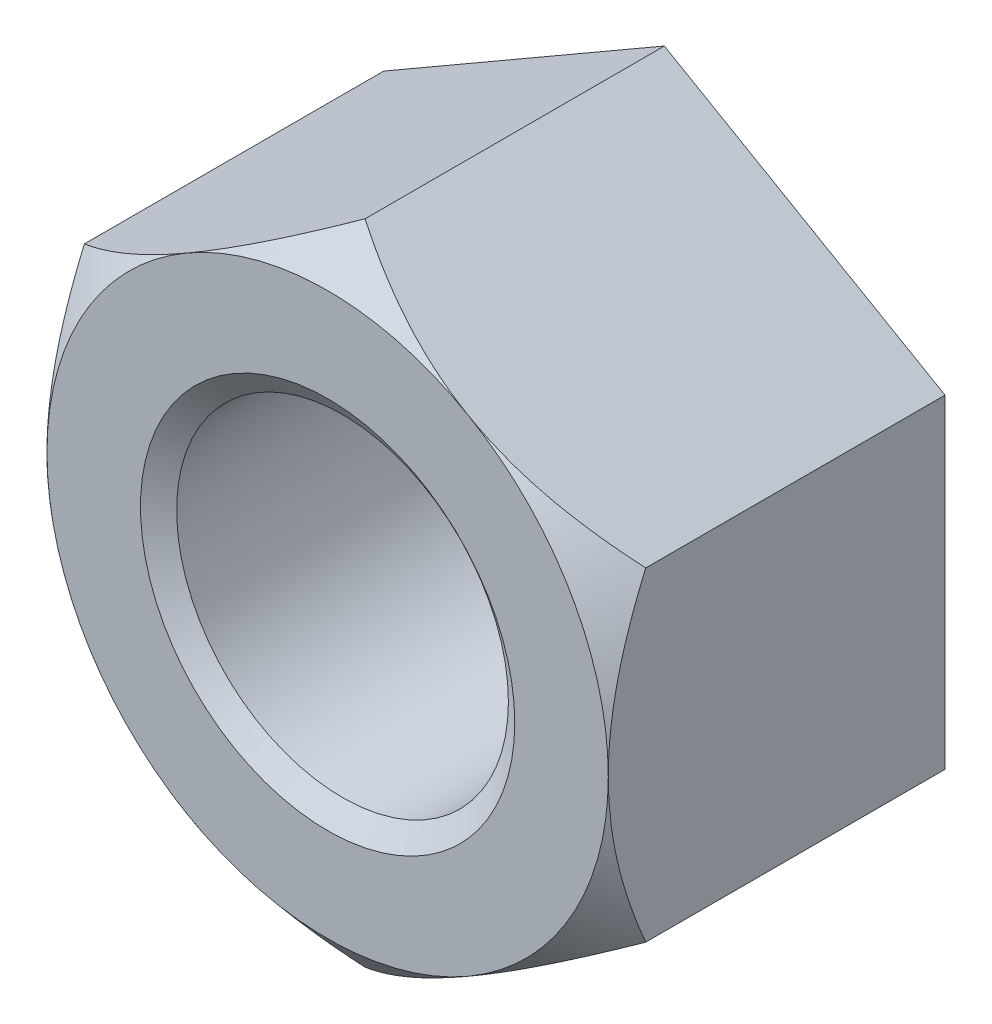
ISO-10303-21;
HEADER;
FILE_DESCRIPTION(('STEP AP214'),'2;1');
FILE_NAME('part.step','',(''),(''),'','','');
FILE_SCHEMA(('AUTOMOTIVE_DESIGN { 1 0 10303 214 1 1 1 1 }'));
ENDSEC;
DATA;
#1=APPLICATION_CONTEXT('core data for automotive mechanical design processes');
#2=APPLICATION_PROTOCOL_DEFINITION('international standard','automotive_design',2000,#1);
#3=PRODUCT_CONTEXT('',#1,'mechanical');
#4=PRODUCT('Part','Part','',(#3));
#5=PRODUCT_RELATED_PRODUCT_CATEGORY('part','',(#4));
#6=PRODUCT_DEFINITION_FORMATION('','',#4);
#7=PRODUCT_DEFINITION_CONTEXT('part definition',#1,'design');
#8=PRODUCT_DEFINITION('design','',#6,#7);
#9=PRODUCT_DEFINITION_SHAPE('','',#8);
#10=(LENGTH_UNIT() NAMED_UNIT(*) SI_UNIT(.MILLI.,.METRE.));
#11=(NAMED_UNIT(*) PLANE_ANGLE_UNIT() SI_UNIT($,.RADIAN.));
#12=(NAMED_UNIT(*) SI_UNIT($,.STERADIAN.) SOLID_ANGLE_UNIT());
#13=UNCERTAINTY_MEASURE_WITH_UNIT(LENGTH_MEASURE(1.E-05),#10,'distance_accuracy_value','');
#14=(GEOMETRIC_REPRESENTATION_CONTEXT(3) GLOBAL_UNCERTAINTY_ASSIGNED_CONTEXT((#13)) GLOBAL_UNIT_ASSIGNED_CONTEXT((#10,
#11,#12)) REPRESENTATION_CONTEXT('',''));
#15=CARTESIAN_POINT('',(0.,0.,0.));
#16=DIRECTION('',(0.,0.,1.));
#17=DIRECTION('',(1.,0.,0.));
#18=AXIS2_PLACEMENT_3D('',#15,#16,#17);
#19=CARTESIAN_POINT('',(0.,0.,-31.4198));
#20=DIRECTION('',(0.,0.,1.));
#21=DIRECTION('',(1.,0.,0.));
#22=AXIS2_PLACEMENT_3D('',#19,#20,#21);
#23=CYLINDRICAL_SURFACE('',#22,15.47876);
#24=CARTESIAN_POINT('',(0.,0.,-1.38902970184812));
#25=DIRECTION('',(0.,0.,1.));
#26=DIRECTION('',(1.,0.,0.));
#27=AXIS2_PLACEMENT_3D('',#24,#25,#26);
#28=CIRCLE('',#27,15.47876);
#29=CARTESIAN_POINT('',(15.47876,0.,-1.38902970184812));
#30=VERTEX_POINT('',#29);
#31=EDGE_CURVE('E130',#30,#30,#28,.F.);
#32=ORIENTED_EDGE('',*,*,#31,.F.);
#33=EDGE_LOOP('',(#32));
#34=FACE_BOUND('',#33,.T.);
#35=CARTESIAN_POINT('',(0.,0.,-30.0053702981519));
#36=DIRECTION('',(0.,0.,-1.));
#37=DIRECTION('',(-1.,0.,0.));
#38=AXIS2_PLACEMENT_3D('',#35,#36,#37);
#39=CIRCLE('',#38,15.47876);
#40=CARTESIAN_POINT('',(-15.47876,0.,-30.0053702981519));
#41=VERTEX_POINT('',#40);
#42=EDGE_CURVE('E37',#41,#41,#39,.F.);
#43=ORIENTED_EDGE('',*,*,#42,.F.);
#44=EDGE_LOOP('',(#43));
#45=FACE_BOUND('',#44,.T.);
#46=ADVANCED_FACE('F32',(#34,#45),#23,.F.);
#47=CARTESIAN_POINT('',(-52.3747999999999,0.,0.));
#48=DIRECTION('',(0.,0.,1.));
#49=DIRECTION('',(1.,0.,0.));
#50=AXIS2_PLACEMENT_3D('',#47,#48,#49);
#51=PLANE('',#50);
#52=CARTESIAN_POINT('',(0.,0.,0.));
#53=DIRECTION('',(0.,0.,1.));
#54=DIRECTION('',(1.,0.,0.));
#55=AXIS2_PLACEMENT_3D('',#52,#53,#54);
#56=CIRCLE('',#55,17.4625);
#57=CARTESIAN_POINT('',(17.4625,0.,0.));
#58=VERTEX_POINT('',#57);
#59=EDGE_CURVE('E217',#58,#58,#56,.T.);
#60=ORIENTED_EDGE('',*,*,#59,.F.);
#61=EDGE_LOOP('',(#60));
#62=FACE_BOUND('',#61,.T.);
#63=CARTESIAN_POINT('',(0.,0.,0.));
#64=DIRECTION('',(0.,0.,1.));
#65=DIRECTION('',(1.,0.,0.));
#66=AXIS2_PLACEMENT_3D('',#63,#64,#65);
#67=CIRCLE('',#66,26.1874);
#68=CARTESIAN_POINT('',(26.1874,0.,0.));
#69=VERTEX_POINT('',#68);
#70=CARTESIAN_POINT('',(13.0937,-22.6789536590646,0.));
#71=VERTEX_POINT('',#70);
#72=EDGE_CURVE('E11',#69,#71,#67,.F.);
#73=ORIENTED_EDGE('',*,*,#72,.F.);
#74=CARTESIAN_POINT('',(0.,0.,0.));
#75=DIRECTION('',(0.,0.,1.));
#76=DIRECTION('',(1.,0.,0.));
#77=AXIS2_PLACEMENT_3D('',#74,#75,#76);
#78=CIRCLE('',#77,26.1874);
#79=CARTESIAN_POINT('',(13.0937,22.6789536590646,0.));
#80=VERTEX_POINT('',#79);
#81=EDGE_CURVE('E122',#69,#80,#78,.T.);
#82=ORIENTED_EDGE('',*,*,#81,.T.);
#83=CARTESIAN_POINT('',(-13.0937,22.6789536590646,0.));
#84=VERTEX_POINT('',#83);
#85=EDGE_CURVE('E44',#84,#80,#67,.F.);
#86=ORIENTED_EDGE('',*,*,#85,.F.);
#87=CARTESIAN_POINT('',(-26.1874,0.,0.));
#88=VERTEX_POINT('',#87);
#89=EDGE_CURVE('E271',#88,#84,#67,.F.);
#90=ORIENTED_EDGE('',*,*,#89,.F.);
#91=CARTESIAN_POINT('',(-13.0937,-22.6789536590646,0.));
#92=VERTEX_POINT('',#91);
#93=EDGE_CURVE('E273',#92,#88,#67,.F.);
#94=ORIENTED_EDGE('',*,*,#93,.F.);
#95=EDGE_CURVE('E42',#71,#92,#67,.F.);
#96=ORIENTED_EDGE('',*,*,#95,.F.);
#97=EDGE_LOOP('',(#73,#82,#86,#90,#94,#96));
#98=FACE_BOUND('',#97,.T.);
#99=ADVANCED_FACE('F132',(#62,#98),#51,.T.);
#100=CARTESIAN_POINT('',(0.,30.2386048787528,-31.4198));
#101=DIRECTION('',(-0.500000000000001,0.866025403784438,0.));
#102=DIRECTION('',(-0.866025403784438,-0.500000000000001,0.));
#103=AXIS2_PLACEMENT_3D('',#100,#101,#102);
#104=PLANE('',#103);
#105=CARTESIAN_POINT('',(0.000199999999996811,30.2387203488067,-3.4925995460573));
#106=CARTESIAN_POINT('',(-0.513173394198176,29.9423240814716,-3.23712054460036));
#107=CARTESIAN_POINT('',(-1.030160973984,29.6438411631145,-2.99102600486844));
#108=CARTESIAN_POINT('',(-2.07185619918651,29.0424181444303,-2.52064199840242));
#109=CARTESIAN_POINT('',(-2.59656819967267,28.7394755297026,-2.2963654207915));
#110=CARTESIAN_POINT('',(-3.65628439390453,28.1276480996982,-1.87188633069804));
#111=CARTESIAN_POINT('',(-4.19132731275463,27.8187409264721,-1.67181180502062));
#112=CARTESIAN_POINT('',(-5.26885590207632,27.1966295053677,-1.3006798900169));
#113=CARTESIAN_POINT('',(-5.81134031031239,26.8834259862414,-1.12961764379398));
#114=CARTESIAN_POINT('',(-6.89352018851056,26.2586291422521,-0.822885333832221));
#115=CARTESIAN_POINT('',(-7.43309184425616,25.9471073015603,-0.686636703030734));
#116=CARTESIAN_POINT('',(-8.51801013727193,25.3207294330389,-0.448890131279074));
#117=CARTESIAN_POINT('',(-9.06335694603955,25.0058733061952,-0.347393225307198));
#118=CARTESIAN_POINT('',(-10.1571309574724,24.3743825862619,-0.182123961213425));
#119=CARTESIAN_POINT('',(-10.7055487163383,24.0577534455522,-0.118268913666265));
#120=CARTESIAN_POINT('',(-11.8047484870155,23.4231301620586,-0.0298594775374858));
#121=CARTESIAN_POINT('',(-12.3555303257296,23.1051361192122,-0.00530225918924691));
#122=CARTESIAN_POINT('',(-13.3804093314794,22.5134219493558,0.0031300715992425));
#123=CARTESIAN_POINT('',(-13.8544797111046,22.2397172880643,-0.00779494002805709));
#124=CARTESIAN_POINT('',(-14.8014126189524,21.6930053188139,-0.0590211283589545));
#125=CARTESIAN_POINT('',(-15.2742751872026,21.419997987745,-0.0993213185349796));
#126=CARTESIAN_POINT('',(-16.2178635349034,20.8752170011957,-0.20842230001161));
#127=CARTESIAN_POINT('',(-16.6885874735473,20.6034444085057,-0.277244166141045));
#128=CARTESIAN_POINT('',(-17.6264602653079,20.061963299717,-0.441912305855732));
#129=CARTESIAN_POINT('',(-18.0936090668783,19.7922548133788,-0.537758968334367));
#130=CARTESIAN_POINT('',(-19.0235590530769,19.2553479385141,-0.754617753182758));
#131=CARTESIAN_POINT('',(-19.4863595787717,18.9881499304231,-0.875633627377015));
#132=CARTESIAN_POINT('',(-20.4070035421374,18.4566158903461,-1.14072210773377));
#133=CARTESIAN_POINT('',(-20.8648462286806,18.1922802920239,-1.28479815681461));
#134=CARTESIAN_POINT('',(-22.2299280534777,17.4041499330114,-1.74815961312341));
#135=CARTESIAN_POINT('',(-23.1293122415491,16.8848902299235,-2.09872149466566));
#136=CARTESIAN_POINT('',(-24.3833445228425,16.1608743547463,-2.64044063744209));
#137=CARTESIAN_POINT('',(-24.7472444629569,15.9507766263632,-2.80407568480622));
#138=CARTESIAN_POINT('',(-25.4705171607616,15.5331949395881,-3.14115557011202));
#139=CARTESIAN_POINT('',(-25.8298992747983,15.3257055793071,-3.31457361129248));
#140=CARTESIAN_POINT('',(-26.1876,15.1191869693225,-3.49259954605727));
#141=B_SPLINE_CURVE_WITH_KNOTS('',3,(#105,#106,#107,#108,#109,#110,#111,#112,#113,#114,#115,
#116,#117,#118,#119,#120,#121,#122,#123,#124,#125,#126,#127,#128,#129,#130,#131,#132,#133,#134,
#135,#136,#137,#138,#139,#140),.UNSPECIFIED.,.F.,.F.,(4,2,2,2,2,2,2,2,2,2,2,2,2,2,2,2,2,4),(0.,
1.9366001538316,3.87433750819639,5.82191141966341,7.76915896856066,9.68156029667425,
11.5940185751047,13.5022598687817,15.410363747221,17.0521398184253,18.6938607552331,
20.3367969379905,21.9797567642053,23.6229616724106,25.26641214279,28.5512264803038,
29.9039535576959,31.2531400595894),.UNSPECIFIED.);
#142=CARTESIAN_POINT('',(0.,30.2386048787528,-3.4925));
#143=VERTEX_POINT('',#142);
#144=EDGE_CURVE('E182',#143,#84,#141,.T.);
#145=ORIENTED_EDGE('',*,*,#144,.F.);
#146=DIRECTION('',(0.,0.,1.));
#147=VECTOR('',#146,1.);
#148=CARTESIAN_POINT('',(0.,30.2386048787528,-31.4198));
#149=LINE('',#148,#147);
#150=CARTESIAN_POINT('',(0.,30.2386048787528,-31.4198));
#151=VERTEX_POINT('',#150);
#152=EDGE_CURVE('E241',#151,#143,#149,.T.);
#153=ORIENTED_EDGE('',*,*,#152,.F.);
#154=DIRECTION('',(-0.866025403784438,-0.500000000000001,0.));
#155=VECTOR('',#154,1.);
#156=CARTESIAN_POINT('',(0.,30.2386048787528,-31.4198));
#157=LINE('',#156,#155);
#158=CARTESIAN_POINT('',(-26.1874,15.1193024393764,-31.4198));
#159=VERTEX_POINT('',#158);
#160=EDGE_CURVE('E138',#151,#159,#157,.T.);
#161=ORIENTED_EDGE('',*,*,#160,.T.);
#162=DIRECTION('',(0.,0.,1.));
#163=VECTOR('',#162,1.);
#164=CARTESIAN_POINT('',(-26.1874,15.1193024393764,-31.4198));
#165=LINE('',#164,#163);
#166=CARTESIAN_POINT('',(-26.1874,15.1193024393764,-3.4925));
#167=VERTEX_POINT('',#166);
#168=EDGE_CURVE('E228',#159,#167,#165,.T.);
#169=ORIENTED_EDGE('',*,*,#168,.T.);
#170=EDGE_CURVE('E177',#84,#167,#141,.T.);
#171=ORIENTED_EDGE('',*,*,#170,.F.);
#172=EDGE_LOOP('',(#145,#153,#161,#169,#171));
#173=FACE_BOUND('',#172,.T.);
#174=ADVANCED_FACE('F34',(#173),#104,.T.);
#175=CARTESIAN_POINT('',(26.1874,15.1193024393764,-31.4198));
#176=DIRECTION('',(0.500000000000001,0.866025403784438,0.));
#177=DIRECTION('',(-0.866025403784438,0.500000000000001,0.));
#178=AXIS2_PLACEMENT_3D('',#175,#176,#177);
#179=PLANE('',#178);
#180=CARTESIAN_POINT('',(26.1876,15.1191869693225,-3.49259954605727));
#181=CARTESIAN_POINT('',(25.6742266058018,15.4155832366577,-3.23712054460033));
#182=CARTESIAN_POINT('',(25.157239026016,15.7140661550147,-2.99102600486842));
#183=CARTESIAN_POINT('',(24.1155438008135,16.3154891736989,-2.5206419984024));
#184=CARTESIAN_POINT('',(23.5908318003273,16.6184317884266,-2.29636542079148));
#185=CARTESIAN_POINT('',(22.5311156060955,17.230259218431,-1.87188633069802));
#186=CARTESIAN_POINT('',(21.9960726872454,17.5391663916571,-1.6718118050206));
#187=CARTESIAN_POINT('',(20.9185440979237,18.1612778127615,-1.30067989001689));
#188=CARTESIAN_POINT('',(20.3760596896876,18.4744813318878,-1.12961764379397));
#189=CARTESIAN_POINT('',(19.2938798114894,19.0992781758771,-0.822885333832213));
#190=CARTESIAN_POINT('',(18.7543081557438,19.4108000165689,-0.686636703030725));
#191=CARTESIAN_POINT('',(17.6693898627281,20.0371778850903,-0.448890131279066));
#192=CARTESIAN_POINT('',(17.1240430539605,20.352034011934,-0.347393225307192));
#193=CARTESIAN_POINT('',(16.0302690425277,20.9835247318673,-0.182123961213423));
#194=CARTESIAN_POINT('',(15.4818512836617,21.300153872577,-0.118268913666263));
#195=CARTESIAN_POINT('',(14.3826515129845,21.9347771560706,-0.0298594775374856));
#196=CARTESIAN_POINT('',(13.8318696742704,22.2527711989169,-0.00530225918924716));
#197=CARTESIAN_POINT('',(12.8069906685206,22.8444853687734,0.00313007159924154));
#198=CARTESIAN_POINT('',(12.3329202888954,23.1181900300648,-0.00779494002805839));
#199=CARTESIAN_POINT('',(11.3859873810476,23.6649019993153,-0.0590211283589573));
#200=CARTESIAN_POINT('',(10.9131248127974,23.9379093303842,-0.0993213185349835));
#201=CARTESIAN_POINT('',(9.96953646509659,24.4826903169335,-0.208422300011616));
#202=CARTESIAN_POINT('',(9.49881252645276,24.7544629096235,-0.277244166141053));
#203=CARTESIAN_POINT('',(8.56093973469211,25.2959440184122,-0.441912305855739));
#204=CARTESIAN_POINT('',(8.09379093312174,25.5656525047504,-0.537758968334371));
#205=CARTESIAN_POINT('',(7.16384094692312,26.1025593796151,-0.754617753182763));
#206=CARTESIAN_POINT('',(6.7010404212283,26.3697573877061,-0.875633627377023));
#207=CARTESIAN_POINT('',(5.78039645786259,26.9012914277831,-1.14072210773378));
#208=CARTESIAN_POINT('',(5.32255377131939,27.1656270261053,-1.28479815681462));
#209=CARTESIAN_POINT('',(3.95747194652233,27.9537573851178,-1.74815961312341));
#210=CARTESIAN_POINT('',(3.05808775845095,28.4730170882057,-2.09872149466566));
#211=CARTESIAN_POINT('',(1.80405547715751,29.1970329633829,-2.6404406374421));
#212=CARTESIAN_POINT('',(1.44015553704315,29.407130691766,-2.80407568480623));
#213=CARTESIAN_POINT('',(0.716882839238417,29.8247123785411,-3.14115557011204));
#214=CARTESIAN_POINT('',(0.3575007252017,30.0322017388221,-3.3145736112925));
#215=CARTESIAN_POINT('',(-0.000200000000002632,30.2387203488067,-3.4925995460573));
#216=B_SPLINE_CURVE_WITH_KNOTS('',3,(#180,#181,#182,#183,#184,#185,#186,#187,#188,#189,#190,
#191,#192,#193,#194,#195,#196,#197,#198,#199,#200,#201,#202,#203,#204,#205,#206,#207,#208,#209,
#210,#211,#212,#213,#214,#215),.UNSPECIFIED.,.F.,.F.,(4,2,2,2,2,2,2,2,2,2,2,2,2,2,2,2,2,4),(0.,
1.9366001538316,3.87433750819638,5.82191141966339,7.76915896856064,9.68156029667423,
11.5940185751047,13.5022598687817,15.4103637472209,17.0521398184253,18.6938607552331,
20.3367969379905,21.9797567642053,23.6229616724105,25.26641214279,28.5512264803038,
29.9039535576959,31.2531400595894),.UNSPECIFIED.);
#217=CARTESIAN_POINT('',(26.1874,15.1193024393764,-3.4925));
#218=VERTEX_POINT('',#217);
#219=EDGE_CURVE('E125',#218,#80,#216,.T.);
#220=ORIENTED_EDGE('',*,*,#219,.F.);
#221=DIRECTION('',(0.,0.,1.));
#222=VECTOR('',#221,1.);
#223=CARTESIAN_POINT('',(26.1874,15.1193024393764,-31.4198));
#224=LINE('',#223,#222);
#225=CARTESIAN_POINT('',(26.1874,15.1193024393764,-31.4198));
#226=VERTEX_POINT('',#225);
#227=EDGE_CURVE('E137',#226,#218,#224,.T.);
#228=ORIENTED_EDGE('',*,*,#227,.F.);
#229=DIRECTION('',(-0.866025403784438,0.500000000000001,0.));
#230=VECTOR('',#229,1.);
#231=CARTESIAN_POINT('',(26.1874,15.1193024393764,-31.4198));
#232=LINE('',#231,#230);
#233=EDGE_CURVE('E232',#226,#151,#232,.T.);
#234=ORIENTED_EDGE('',*,*,#233,.T.);
#235=ORIENTED_EDGE('',*,*,#152,.T.);
#236=EDGE_CURVE('E148',#80,#143,#216,.T.);
#237=ORIENTED_EDGE('',*,*,#236,.F.);
#238=EDGE_LOOP('',(#220,#228,#234,#235,#237));
#239=FACE_BOUND('',#238,.T.);
#240=ADVANCED_FACE('F163',(#239),#179,.T.);
#241=CARTESIAN_POINT('',(26.1874,15.1193024393764,-31.4198));
#242=DIRECTION('',(-1.,0.,0.));
#243=DIRECTION('',(0.,0.,1.));
#244=AXIS2_PLACEMENT_3D('',#241,#242,#243);
#245=PLANE('',#244);
#246=ORIENTED_EDGE('',*,*,#227,.T.);
#247=CARTESIAN_POINT('',(26.1874,-33.4640354906226,-14.0565423629271));
#248=CARTESIAN_POINT('',(26.1874,-33.0407746347166,-13.7691881736319));
#249=CARTESIAN_POINT('',(26.1874,-32.6165571106371,-13.4832440937609));
#250=CARTESIAN_POINT('',(26.1874,-31.7660401415196,-12.914455485409));
#251=CARTESIAN_POINT('',(26.1874,-31.339740664267,-12.6316110051099));
#252=CARTESIAN_POINT('',(26.1874,-30.0573097291377,-11.788043237694));
#253=CARTESIAN_POINT('',(26.1874,-29.1978203606967,-11.2324044816204));
#254=CARTESIAN_POINT('',(26.1874,-27.4622936158139,-10.1336577392283));
#255=CARTESIAN_POINT('',(26.1874,-26.5861821055641,-9.59066658940168));
#256=CARTESIAN_POINT('',(26.1874,-24.8216648023432,-8.52510234082127));
#257=CARTESIAN_POINT('',(26.1874,-23.9332597888499,-8.00252795548914));
#258=CARTESIAN_POINT('',(26.1874,-22.0934376846439,-6.95488948540693));
#259=CARTESIAN_POINT('',(26.1874,-21.1412173228405,-6.43122911959484));
#260=CARTESIAN_POINT('',(26.1874,-19.2179109755683,-5.41917114747219));
#261=CARTESIAN_POINT('',(26.1874,-18.2468222505134,-4.93077871117163));
#262=CARTESIAN_POINT('',(26.1874,-16.2858249096375,-4.00024738579759));
#263=CARTESIAN_POINT('',(26.1874,-15.2959747009191,-3.5579862416223));
#264=CARTESIAN_POINT('',(26.1874,-13.2927456398708,-2.73059024447434));
#265=CARTESIAN_POINT('',(26.1874,-12.2793767023743,-2.34543180695207));
#266=CARTESIAN_POINT('',(26.1874,-10.7553803630876,-1.82671246462318));
#267=CARTESIAN_POINT('',(26.1874,-10.2540776706142,-1.6655893102275));
#268=CARTESIAN_POINT('',(26.1874,-9.24575138068171,-1.36228852206027));
#269=CARTESIAN_POINT('',(26.1874,-8.73872795431945,-1.22011032329955));
#270=CARTESIAN_POINT('',(26.1874,-7.71922567786316,-0.95663251864597));
#271=CARTESIAN_POINT('',(26.1874,-7.20674644106776,-0.835334403312232));
#272=CARTESIAN_POINT('',(26.1874,-6.1769285738306,-0.615535347072359));
#273=CARTESIAN_POINT('',(26.1874,-5.65959024670224,-0.517032992925221));
#274=CARTESIAN_POINT('',(26.1874,-4.63047547477933,-0.346152584745227));
#275=CARTESIAN_POINT('',(26.1874,-4.11877434620285,-0.273323043401525));
#276=CARTESIAN_POINT('',(26.1874,-3.09242158702781,-0.15263877708194));
#277=CARTESIAN_POINT('',(26.1874,-2.57776997992021,-0.104783853543056));
#278=CARTESIAN_POINT('',(26.1874,-1.54674640128364,-0.0350055118174946));
#279=CARTESIAN_POINT('',(26.1874,-1.03037458020004,-0.0130798826865196));
#280=CARTESIAN_POINT('',(26.1874,0.00281373395253119,0.00439081573513733));
#281=CARTESIAN_POINT('',(26.1874,0.519630220482704,-6.37334660406017E-05));
#282=CARTESIAN_POINT('',(26.1874,1.51784720014737,-0.0340789658247308));
#283=CARTESIAN_POINT('',(26.1874,1.99930668816336,-0.0619421973765469));
#284=CARTESIAN_POINT('',(26.1874,2.96039298537845,-0.140052621075192));
#285=CARTESIAN_POINT('',(26.1874,3.44001982092807,-0.190299490151487));
#286=CARTESIAN_POINT('',(26.1874,4.39653344072961,-0.312320178016979));
#287=CARTESIAN_POINT('',(26.1874,4.87342010927479,-0.384094899134984));
#288=CARTESIAN_POINT('',(26.1874,5.82366675283079,-0.548023418550825));
#289=CARTESIAN_POINT('',(26.1874,6.29702668697732,-0.640177452605451));
#290=CARTESIAN_POINT('',(26.1874,7.24941488707848,-0.845630112305757));
#291=CARTESIAN_POINT('',(26.1874,7.72835665842312,-0.959328183429298));
#292=CARTESIAN_POINT('',(26.1874,8.68151250142992,-1.20500429553773));
#293=CARTESIAN_POINT('',(26.1874,9.15572653117801,-1.33698249843199));
#294=CARTESIAN_POINT('',(26.1874,10.0990528436431,-1.61759280287037));
#295=CARTESIAN_POINT('',(26.1874,10.5681664092471,-1.76622060511418));
#296=CARTESIAN_POINT('',(26.1874,11.501293499141,-2.07859293356846));
#297=CARTESIAN_POINT('',(26.1874,11.9653071604691,-2.24233705247585));
#298=CARTESIAN_POINT('',(26.1874,13.2708643342995,-2.72484850621357));
#299=CARTESIAN_POINT('',(26.1874,14.1065210236746,-3.05960737488123));
#300=CARTESIAN_POINT('',(26.1874,15.7619371716828,-3.76657752199402));
#301=CARTESIAN_POINT('',(26.1874,16.5816920074393,-4.13879950245644));
#302=CARTESIAN_POINT('',(26.1874,18.2074356777312,-4.91425190878117));
#303=CARTESIAN_POINT('',(26.1874,19.013408431952,-5.31751588844513));
#304=CARTESIAN_POINT('',(26.1874,20.6121672495965,-6.14910126073936));
#305=CARTESIAN_POINT('',(26.1874,21.4049544480517,-6.57742048209015));
#306=CARTESIAN_POINT('',(26.1874,22.9837347613923,-7.45735306095119));
#307=CARTESIAN_POINT('',(26.1874,23.7696579346811,-7.90909147066198));
#308=CARTESIAN_POINT('',(26.1874,25.3312973933873,-8.82986014661864));
#309=CARTESIAN_POINT('',(26.1874,26.1070134948339,-9.2988907239585));
#310=CARTESIAN_POINT('',(26.1874,27.6491010272012,-10.2510900948807));
#311=CARTESIAN_POINT('',(26.1874,28.4154774275268,-10.7342508591629));
#312=CARTESIAN_POINT('',(26.1874,29.9404580401166,-11.7126502123325));
#313=CARTESIAN_POINT('',(26.1874,30.6990623198296,-12.2078886962798));
#314=CARTESIAN_POINT('',(26.1874,32.1349530835595,-13.1592105009498));
#315=CARTESIAN_POINT('',(26.1874,32.8128762481499,-13.6143345775975));
#316=CARTESIAN_POINT('',(26.1874,34.1638401978137,-14.5317809731749));
#317=CARTESIAN_POINT('',(26.1874,34.8368809328203,-14.9941033657673));
#318=CARTESIAN_POINT('',(26.1874,36.178700696536,-15.9250689763432));
#319=CARTESIAN_POINT('',(26.1874,36.8474791664702,-16.393712998964));
#320=CARTESIAN_POINT('',(26.1874,38.18116093128,-17.3364840328786));
#321=CARTESIAN_POINT('',(26.1874,38.8460642128432,-17.8106110629917));
#322=CARTESIAN_POINT('',(26.1874,40.1636369752226,-18.7573870533705));
#323=CARTESIAN_POINT('',(26.1874,40.8163519846945,-19.2299726952115));
#324=CARTESIAN_POINT('',(26.1874,42.1187514600274,-20.1793024825271));
#325=CARTESIAN_POINT('',(26.1874,42.7684359196626,-20.656046636539));
#326=CARTESIAN_POINT('',(26.1874,44.0649065423035,-21.6131035141098));
#327=CARTESIAN_POINT('',(26.1874,44.7116934199872,-22.0934152700954));
#328=CARTESIAN_POINT('',(26.1874,46.0027915799806,-23.057341818718));
#329=CARTESIAN_POINT('',(26.1874,46.6471028869952,-23.5409565782582));
#330=CARTESIAN_POINT('',(26.1874,47.2903085922314,-24.0260331641714));
#331=B_SPLINE_CURVE_WITH_KNOTS('',3,(#247,#248,#249,#250,#251,#252,#253,#254,#255,#256,#257,
#258,#259,#260,#261,#262,#263,#264,#265,#266,#267,#268,#269,#270,#271,#272,#273,#274,#275,#276,
#277,#278,#279,#280,#281,#282,#283,#284,#285,#286,#287,#288,#289,#290,#291,#292,#293,#294,#295,
#296,#297,#298,#299,#300,#301,#302,#303,#304,#305,#306,#307,#308,#309,#310,#311,#312,#313,#314,
#315,#316,#317,#318,#319,#320,#321,#322,#323,#324,#325,#326,#327,#328,#329,#330),.UNSPECIFIED.,
.F.,.F.,(4,2,2,2,2,2,2,2,2,2,2,2,2,2,2,2,2,2,2,2,2,2,2,2,2,2,2,2,2,2,2,2,2,2,2,2,2,2,2,2,2,4),
(0.,1.53475844649293,3.06954071635394,6.13973882129796,9.23171402123178,12.3234940626418,
15.5830497072238,18.8430822119114,22.0942430330266,25.3440572969432,26.92343182557,
28.5027592424828,30.0821993555694,31.6615415237866,33.2115323120688,34.7615107768186,
36.311357068161,37.8611809457984,39.3074473670285,40.7536929144875,42.1999990890553,
43.6463219959998,45.1226872770461,46.5990656352779,48.0750636344556,49.5510218750624,
52.2504359363041,54.9506233347319,57.6537715394684,60.3566858362591,63.0759229592677,
65.7952090264874,68.5129788196219,71.2307250071592,73.6802575239007,76.1298151240051,
78.5796875101133,81.0295683073264,83.4470625476283,85.864561752163,88.2814276463241,
90.6982693584501),.UNSPECIFIED.);
#332=EDGE_CURVE('E117',#218,#69,#331,.F.);
#333=ORIENTED_EDGE('',*,*,#332,.T.);
#334=CARTESIAN_POINT('',(26.1874,-15.1193024393765,-3.4925));
#335=VERTEX_POINT('',#334);
#336=EDGE_CURVE('E106',#69,#335,#331,.F.);
#337=ORIENTED_EDGE('',*,*,#336,.T.);
#338=DIRECTION('',(0.,0.,1.));
#339=VECTOR('',#338,1.);
#340=CARTESIAN_POINT('',(26.1874,-15.1193024393764,-31.4198));
#341=LINE('',#340,#339);
#342=CARTESIAN_POINT('',(26.1874,-15.1193024393764,-31.4198));
#343=VERTEX_POINT('',#342);
#344=EDGE_CURVE('E238',#343,#335,#341,.T.);
#345=ORIENTED_EDGE('',*,*,#344,.F.);
#346=DIRECTION('',(0.,-1.,0.));
#347=VECTOR('',#346,1.);
#348=CARTESIAN_POINT('',(26.1874,15.1193024393764,-31.4198));
#349=LINE('',#348,#347);
#350=EDGE_CURVE('E246',#226,#343,#349,.T.);
#351=ORIENTED_EDGE('',*,*,#350,.F.);
#352=EDGE_LOOP('',(#246,#333,#337,#345,#351));
#353=FACE_BOUND('',#352,.T.);
#354=ADVANCED_FACE('F135',(#353),#245,.F.);
#355=CARTESIAN_POINT('',(0.,-30.2386048787529,-31.4198));
#356=DIRECTION('',(0.500000000000001,-0.866025403784438,0.));
#357=DIRECTION('',(0.866025403784438,0.500000000000001,0.));
#358=AXIS2_PLACEMENT_3D('',#355,#356,#357);
#359=PLANE('',#358);
#360=CARTESIAN_POINT('',(-0.000199999999997566,-30.2387203488067,-3.49259954605736));
#361=CARTESIAN_POINT('',(0.513173394198178,-29.9423240814716,-3.23712054460042));
#362=CARTESIAN_POINT('',(1.030160973984,-29.6438411631146,-2.9910260048685));
#363=CARTESIAN_POINT('',(2.07185619918652,-29.0424181444304,-2.52064199840248));
#364=CARTESIAN_POINT('',(2.59656819967268,-28.7394755297026,-2.29636542079156));
#365=CARTESIAN_POINT('',(3.65628439390455,-28.1276480996983,-1.87188633069809));
#366=CARTESIAN_POINT('',(4.19132731275465,-27.8187409264722,-1.67181180502067));
#367=CARTESIAN_POINT('',(5.26885590207634,-27.1966295053678,-1.30067989001695));
#368=CARTESIAN_POINT('',(5.81134031031241,-26.8834259862415,-1.12961764379404));
#369=CARTESIAN_POINT('',(6.89352018851059,-26.2586291422522,-0.822885333832275));
#370=CARTESIAN_POINT('',(7.43309184425619,-25.9471073015604,-0.686636703030789));
#371=CARTESIAN_POINT('',(8.51801013727196,-25.320729433039,-0.448890131279129));
#372=CARTESIAN_POINT('',(9.06335694603958,-25.0058733061953,-0.347393225307251));
#373=CARTESIAN_POINT('',(10.1571309574724,-24.3743825862619,-0.182123961213478));
#374=CARTESIAN_POINT('',(10.7055487163383,-24.0577534455523,-0.118268913666319));
#375=CARTESIAN_POINT('',(11.8047484870156,-23.4231301620586,-0.0298594775375414));
#376=CARTESIAN_POINT('',(12.3555303257296,-23.1051361192123,-0.00530225918930227));
#377=CARTESIAN_POINT('',(13.3804093314795,-22.5134219493558,0.00313007159918741));
#378=CARTESIAN_POINT('',(13.8544797111047,-22.2397172880644,-0.007794940028112));
#379=CARTESIAN_POINT('',(14.8014126189524,-21.693005318814,-0.0590211283590105));
#380=CARTESIAN_POINT('',(15.2742751872026,-21.419997987745,-0.0993213185350369));
#381=CARTESIAN_POINT('',(16.2178635349035,-20.8752170011957,-0.20842230001167));
#382=CARTESIAN_POINT('',(16.6885874735473,-20.6034444085057,-0.277244166141106));
#383=CARTESIAN_POINT('',(17.626460265308,-20.0619632997171,-0.441912305855793));
#384=CARTESIAN_POINT('',(18.0936090668783,-19.7922548133788,-0.537758968334426));
#385=CARTESIAN_POINT('',(19.023559053077,-19.2553479385141,-0.754617753182819));
#386=CARTESIAN_POINT('',(19.4863595787718,-18.9881499304231,-0.875633627377078));
#387=CARTESIAN_POINT('',(20.4070035421375,-18.4566158903461,-1.14072210773384));
#388=CARTESIAN_POINT('',(20.8648462286807,-18.1922802920239,-1.28479815681468));
#389=CARTESIAN_POINT('',(22.2299280534778,-17.4041499330114,-1.74815961312347));
#390=CARTESIAN_POINT('',(23.1293122415492,-16.8848902299235,-2.09872149466573));
#391=CARTESIAN_POINT('',(24.3833445228426,-16.1608743547463,-2.64044063744216));
#392=CARTESIAN_POINT('',(24.7472444629569,-15.9507766263632,-2.80407568480628));
#393=CARTESIAN_POINT('',(25.4705171607616,-15.5331949395881,-3.14115557011207));
#394=CARTESIAN_POINT('',(25.8298992747983,-15.3257055793071,-3.31457361129252));
#395=CARTESIAN_POINT('',(26.1876,-15.1191869693226,-3.4925995460573));
#396=B_SPLINE_CURVE_WITH_KNOTS('',3,(#360,#361,#362,#363,#364,#365,#366,#367,#368,#369,#370,
#371,#372,#373,#374,#375,#376,#377,#378,#379,#380,#381,#382,#383,#384,#385,#386,#387,#388,#389,
#390,#391,#392,#393,#394,#395),.UNSPECIFIED.,.F.,.F.,(4,2,2,2,2,2,2,2,2,2,2,2,2,2,2,2,2,4),(0.,
1.93660015383161,3.87433750819641,5.82191141966344,7.76915896856069,9.68156029667429,
11.5940185751048,13.5022598687817,15.410363747221,17.0521398184254,18.6938607552332,
20.3367969379906,21.9797567642054,23.6229616724107,25.2664121427901,28.5512264803039,
29.903953557696,31.2531400595894),.UNSPECIFIED.);
#397=CARTESIAN_POINT('',(-1.17961196366423E-13,-30.2386048787528,-3.4925));
#398=VERTEX_POINT('',#397);
#399=EDGE_CURVE('E51',#398,#71,#396,.T.);
#400=ORIENTED_EDGE('',*,*,#399,.F.);
#401=DIRECTION('',(0.,0.,1.));
#402=VECTOR('',#401,1.);
#403=CARTESIAN_POINT('',(0.,-30.2386048787529,-31.4198));
#404=LINE('',#403,#402);
#405=CARTESIAN_POINT('',(0.,-30.2386048787529,-31.4198));
#406=VERTEX_POINT('',#405);
#407=EDGE_CURVE('E235',#406,#398,#404,.T.);
#408=ORIENTED_EDGE('',*,*,#407,.F.);
#409=DIRECTION('',(0.866025403784438,0.500000000000001,0.));
#410=VECTOR('',#409,1.);
#411=CARTESIAN_POINT('',(0.,-30.2386048787529,-31.4198));
#412=LINE('',#411,#410);
#413=EDGE_CURVE('E248',#406,#343,#412,.T.);
#414=ORIENTED_EDGE('',*,*,#413,.T.);
#415=ORIENTED_EDGE('',*,*,#344,.T.);
#416=EDGE_CURVE('E112',#71,#335,#396,.T.);
#417=ORIENTED_EDGE('',*,*,#416,.F.);
#418=EDGE_LOOP('',(#400,#408,#414,#415,#417));
#419=FACE_BOUND('',#418,.T.);
#420=ADVANCED_FACE('F162',(#419),#359,.T.);
#421=CARTESIAN_POINT('',(-26.1874,-15.1193024393765,-31.4198));
#422=DIRECTION('',(-0.500000000000001,-0.866025403784438,0.));
#423=DIRECTION('',(0.866025403784438,-0.500000000000001,0.));
#424=AXIS2_PLACEMENT_3D('',#421,#422,#423);
#425=PLANE('',#424);
#426=CARTESIAN_POINT('',(-26.1876,-15.1191869693226,-3.4925995460573));
#427=CARTESIAN_POINT('',(-25.6742266058018,-15.4155832366577,-3.23712054460037));
#428=CARTESIAN_POINT('',(-25.157239026016,-15.7140661550148,-2.99102600486845));
#429=CARTESIAN_POINT('',(-24.1155438008135,-16.315489173699,-2.52064199840244));
#430=CARTESIAN_POINT('',(-23.5908318003273,-16.6184317884267,-2.29636542079152));
#431=CARTESIAN_POINT('',(-22.5311156060955,-17.2302592184311,-1.87188633069806));
#432=CARTESIAN_POINT('',(-21.9960726872454,-17.5391663916572,-1.67181180502064));
#433=CARTESIAN_POINT('',(-20.9185440979237,-18.1612778127616,-1.30067989001693));
#434=CARTESIAN_POINT('',(-20.3760596896876,-18.4744813318878,-1.12961764379402));
#435=CARTESIAN_POINT('',(-19.2938798114895,-19.0992781758771,-0.822885333832261));
#436=CARTESIAN_POINT('',(-18.7543081557439,-19.4108000165689,-0.686636703030775));
#437=CARTESIAN_POINT('',(-17.6693898627281,-20.0371778850904,-0.448890131279118));
#438=CARTESIAN_POINT('',(-17.1240430539605,-20.352034011934,-0.347393225307244));
#439=CARTESIAN_POINT('',(-16.0302690425277,-20.9835247318674,-0.182123961213476));
#440=CARTESIAN_POINT('',(-15.4818512836617,-21.300153872577,-0.118268913666318));
#441=CARTESIAN_POINT('',(-14.3826515129845,-21.9347771560707,-0.0298594775375406));
#442=CARTESIAN_POINT('',(-13.8318696742705,-22.252771198917,-0.00530225918930157));
#443=CARTESIAN_POINT('',(-12.8069906685207,-22.8444853687735,0.00313007159918731));
#444=CARTESIAN_POINT('',(-12.3329202888954,-23.1181900300649,-0.00779494002811284));
#445=CARTESIAN_POINT('',(-11.3859873810477,-23.6649019993153,-0.0590211283590106));
#446=CARTESIAN_POINT('',(-10.9131248127975,-23.9379093303843,-0.0993213185350354));
#447=CARTESIAN_POINT('',(-9.96953646509664,-24.4826903169335,-0.208422300011667));
#448=CARTESIAN_POINT('',(-9.49881252645281,-24.7544629096236,-0.277244166141105));
#449=CARTESIAN_POINT('',(-8.56093973469215,-25.2959440184122,-0.441912305855791));
#450=CARTESIAN_POINT('',(-8.09379093312179,-25.5656525047505,-0.537758968334423));
#451=CARTESIAN_POINT('',(-7.16384094692317,-26.1025593796151,-0.754617753182813));
#452=CARTESIAN_POINT('',(-6.70104042122835,-26.3697573877061,-0.87563362737707));
#453=CARTESIAN_POINT('',(-5.78039645786263,-26.9012914277831,-1.14072210773383));
#454=CARTESIAN_POINT('',(-5.32255377131944,-27.1656270261054,-1.28479815681467));
#455=CARTESIAN_POINT('',(-3.95747194652237,-27.9537573851178,-1.74815961312346));
#456=CARTESIAN_POINT('',(-3.05808775845099,-28.4730170882057,-2.0987214946657));
#457=CARTESIAN_POINT('',(-1.80405547715755,-29.197032963383,-2.64044063744214));
#458=CARTESIAN_POINT('',(-1.44015553704318,-29.4071306917661,-2.80407568480628));
#459=CARTESIAN_POINT('',(-0.716882839238433,-29.8247123785412,-3.14115557011209));
#460=CARTESIAN_POINT('',(-0.357500725201709,-30.0322017388222,-3.31457361129256));
#461=CARTESIAN_POINT('',(0.000200000000001255,-30.2387203488067,-3.49259954605736));
#462=B_SPLINE_CURVE_WITH_KNOTS('',3,(#426,#427,#428,#429,#430,#431,#432,#433,#434,#435,#436,
#437,#438,#439,#440,#441,#442,#443,#444,#445,#446,#447,#448,#449,#450,#451,#452,#453,#454,#455,
#456,#457,#458,#459,#460,#461),.UNSPECIFIED.,.F.,.F.,(4,2,2,2,2,2,2,2,2,2,2,2,2,2,2,2,2,4),(0.,
1.93660015383159,3.87433750819638,5.82191141966338,7.76915896856062,9.6815602966742,
11.5940185751047,13.5022598687816,15.4103637472209,17.0521398184252,18.693860755233,
20.3367969379904,21.9797567642053,23.6229616724105,25.2664121427899,28.5512264803037,
29.9039535576958,31.2531400595894),.UNSPECIFIED.);
#463=CARTESIAN_POINT('',(-26.1874,-15.1193024393764,-3.4925));
#464=VERTEX_POINT('',#463);
#465=EDGE_CURVE('E58',#464,#92,#462,.T.);
#466=ORIENTED_EDGE('',*,*,#465,.F.);
#467=DIRECTION('',(0.,0.,1.));
#468=VECTOR('',#467,1.);
#469=CARTESIAN_POINT('',(-26.1874,-15.1193024393765,-31.4198));
#470=LINE('',#469,#468);
#471=CARTESIAN_POINT('',(-26.1874,-15.1193024393765,-31.4198));
#472=VERTEX_POINT('',#471);
#473=EDGE_CURVE('E231',#472,#464,#470,.T.);
#474=ORIENTED_EDGE('',*,*,#473,.F.);
#475=DIRECTION('',(0.866025403784438,-0.500000000000001,0.));
#476=VECTOR('',#475,1.);
#477=CARTESIAN_POINT('',(-26.1874,-15.1193024393765,-31.4198));
#478=LINE('',#477,#476);
#479=EDGE_CURVE('E251',#472,#406,#478,.T.);
#480=ORIENTED_EDGE('',*,*,#479,.T.);
#481=ORIENTED_EDGE('',*,*,#407,.T.);
#482=EDGE_CURVE('E176',#92,#398,#462,.T.);
#483=ORIENTED_EDGE('',*,*,#482,.F.);
#484=EDGE_LOOP('',(#466,#474,#480,#481,#483));
#485=FACE_BOUND('',#484,.T.);
#486=ADVANCED_FACE('F169',(#485),#425,.T.);
#487=CARTESIAN_POINT('',(-26.1874,15.1193024393764,-31.4198));
#488=DIRECTION('',(-1.,0.,0.));
#489=DIRECTION('',(0.,0.,1.));
#490=AXIS2_PLACEMENT_3D('',#487,#488,#489);
#491=PLANE('',#490);
#492=CARTESIAN_POINT('',(-26.1874,-33.4640354906226,-14.0565423629272));
#493=CARTESIAN_POINT('',(-26.1874,-33.0407746347166,-13.7691881736319));
#494=CARTESIAN_POINT('',(-26.1874,-32.6165571106371,-13.483244093761));
#495=CARTESIAN_POINT('',(-26.1874,-31.7660401415196,-12.914455485409));
#496=CARTESIAN_POINT('',(-26.1874,-31.3397406642671,-12.6316110051099));
#497=CARTESIAN_POINT('',(-26.1874,-30.0573097291378,-11.788043237694));
#498=CARTESIAN_POINT('',(-26.1874,-29.1978203606968,-11.2324044816204));
#499=CARTESIAN_POINT('',(-26.1874,-27.4622936158139,-10.1336577392283));
#500=CARTESIAN_POINT('',(-26.1874,-26.5861821055642,-9.5906665894017));
#501=CARTESIAN_POINT('',(-26.1874,-24.8216648023433,-8.52510234082129));
#502=CARTESIAN_POINT('',(-26.1874,-23.9332597888499,-8.00252795548916));
#503=CARTESIAN_POINT('',(-26.1874,-22.0934376846439,-6.95488948540696));
#504=CARTESIAN_POINT('',(-26.1874,-21.1412173228405,-6.43122911959486));
#505=CARTESIAN_POINT('',(-26.1874,-19.2179109755684,-5.41917114747221));
#506=CARTESIAN_POINT('',(-26.1874,-18.2468222505135,-4.93077871117164));
#507=CARTESIAN_POINT('',(-26.1874,-16.2858249096376,-4.0002473857976));
#508=CARTESIAN_POINT('',(-26.1874,-15.2959747009191,-3.55798624162231));
#509=CARTESIAN_POINT('',(-26.1874,-13.2927456398709,-2.73059024447435));
#510=CARTESIAN_POINT('',(-26.1874,-12.2793767023743,-2.34543180695208));
#511=CARTESIAN_POINT('',(-26.1874,-10.7553803630876,-1.82671246462318));
#512=CARTESIAN_POINT('',(-26.1874,-10.2540776706142,-1.6655893102275));
#513=CARTESIAN_POINT('',(-26.1874,-9.24575138068172,-1.36228852206028));
#514=CARTESIAN_POINT('',(-26.1874,-8.73872795431946,-1.22011032329955));
#515=CARTESIAN_POINT('',(-26.1874,-7.71922567786317,-0.956632518645972));
#516=CARTESIAN_POINT('',(-26.1874,-7.20674644106778,-0.835334403312235));
#517=CARTESIAN_POINT('',(-26.1874,-6.17692857383061,-0.615535347072362));
#518=CARTESIAN_POINT('',(-26.1874,-5.65959024670225,-0.517032992925225));
#519=CARTESIAN_POINT('',(-26.1874,-4.63047547477934,-0.346152584745229));
#520=CARTESIAN_POINT('',(-26.1874,-4.11877434620286,-0.273323043401526));
#521=CARTESIAN_POINT('',(-26.1874,-3.09242158702783,-0.15263877708194));
#522=CARTESIAN_POINT('',(-26.1874,-2.57776997992022,-0.104783853543058));
#523=CARTESIAN_POINT('',(-26.1874,-1.54674640128365,-0.0350055118174992));
#524=CARTESIAN_POINT('',(-26.1874,-1.03037458020005,-0.0130798826865235));
#525=CARTESIAN_POINT('',(-26.1874,0.00281373395251839,0.00439081573513529));
#526=CARTESIAN_POINT('',(-26.1874,0.519630220482694,-6.37334660418451E-05));
#527=CARTESIAN_POINT('',(-26.1874,1.51784720014736,-0.0340789658247295));
#528=CARTESIAN_POINT('',(-26.1874,1.99930668816335,-0.0619421973765437));
#529=CARTESIAN_POINT('',(-26.1874,2.96039298537844,-0.140052621075189));
#530=CARTESIAN_POINT('',(-26.1874,3.44001982092806,-0.190299490151486));
#531=CARTESIAN_POINT('',(-26.1874,4.3965334407296,-0.31232017801698));
#532=CARTESIAN_POINT('',(-26.1874,4.87342010927478,-0.384094899134984));
#533=CARTESIAN_POINT('',(-26.1874,5.82366675283077,-0.548023418550823));
#534=CARTESIAN_POINT('',(-26.1874,6.29702668697731,-0.640177452605448));
#535=CARTESIAN_POINT('',(-26.1874,7.24941488707847,-0.845630112305753));
#536=CARTESIAN_POINT('',(-26.1874,7.72835665842311,-0.959328183429293));
#537=CARTESIAN_POINT('',(-26.1874,8.68151250142991,-1.20500429553772));
#538=CARTESIAN_POINT('',(-26.1874,9.155726531178,-1.33698249843199));
#539=CARTESIAN_POINT('',(-26.1874,10.0990528436431,-1.61759280287036));
#540=CARTESIAN_POINT('',(-26.1874,10.5681664092471,-1.76622060511417));
#541=CARTESIAN_POINT('',(-26.1874,11.501293499141,-2.07859293356845));
#542=CARTESIAN_POINT('',(-26.1874,11.965307160469,-2.24233705247585));
#543=CARTESIAN_POINT('',(-26.1874,13.2708643342995,-2.72484850621357));
#544=CARTESIAN_POINT('',(-26.1874,14.1065210236746,-3.05960737488123));
#545=CARTESIAN_POINT('',(-26.1874,15.7619371716828,-3.76657752199402));
#546=CARTESIAN_POINT('',(-26.1874,16.5816920074393,-4.13879950245644));
#547=CARTESIAN_POINT('',(-26.1874,18.2074356777312,-4.91425190878116));
#548=CARTESIAN_POINT('',(-26.1874,19.013408431952,-5.31751588844512));
#549=CARTESIAN_POINT('',(-26.1874,20.6121672495965,-6.14910126073935));
#550=CARTESIAN_POINT('',(-26.1874,21.4049544480517,-6.57742048209015));
#551=CARTESIAN_POINT('',(-26.1874,22.9837347613923,-7.45735306095118));
#552=CARTESIAN_POINT('',(-26.1874,23.7696579346811,-7.90909147066197));
#553=CARTESIAN_POINT('',(-26.1874,25.3312973933873,-8.82986014661863));
#554=CARTESIAN_POINT('',(-26.1874,26.1070134948339,-9.29889072395848));
#555=CARTESIAN_POINT('',(-26.1874,27.6491010272012,-10.2510900948807));
#556=CARTESIAN_POINT('',(-26.1874,28.4154774275267,-10.7342508591629));
#557=CARTESIAN_POINT('',(-26.1874,29.9404580401166,-11.7126502123325));
#558=CARTESIAN_POINT('',(-26.1874,30.6990623198296,-12.2078886962798));
#559=CARTESIAN_POINT('',(-26.1874,32.1349530835595,-13.1592105009498));
#560=CARTESIAN_POINT('',(-26.1874,32.8128762481498,-13.6143345775974));
#561=CARTESIAN_POINT('',(-26.1874,34.1638401978137,-14.5317809731748));
#562=CARTESIAN_POINT('',(-26.1874,34.8368809328203,-14.9941033657673));
#563=CARTESIAN_POINT('',(-26.1874,36.178700696536,-15.9250689763432));
#564=CARTESIAN_POINT('',(-26.1874,36.8474791664701,-16.3937129989639));
#565=CARTESIAN_POINT('',(-26.1874,38.1811609312799,-17.3364840328786));
#566=CARTESIAN_POINT('',(-26.1874,38.8460642128432,-17.8106110629916));
#567=CARTESIAN_POINT('',(-26.1874,40.1636369752226,-18.7573870533705));
#568=CARTESIAN_POINT('',(-26.1874,40.8163519846944,-19.2299726952115));
#569=CARTESIAN_POINT('',(-26.1874,42.1187514600273,-20.179302482527));
#570=CARTESIAN_POINT('',(-26.1874,42.7684359196626,-20.656046636539));
#571=CARTESIAN_POINT('',(-26.1874,44.0649065423034,-21.6131035141098));
#572=CARTESIAN_POINT('',(-26.1874,44.7116934199871,-22.0934152700954));
#573=CARTESIAN_POINT('',(-26.1874,46.0027915799805,-23.0573418187179));
#574=CARTESIAN_POINT('',(-26.1874,46.6471028869951,-23.5409565782582));
#575=CARTESIAN_POINT('',(-26.1874,47.2903085922314,-24.0260331641713));
#576=B_SPLINE_CURVE_WITH_KNOTS('',3,(#492,#493,#494,#495,#496,#497,#498,#499,#500,#501,#502,
#503,#504,#505,#506,#507,#508,#509,#510,#511,#512,#513,#514,#515,#516,#517,#518,#519,#520,#521,
#522,#523,#524,#525,#526,#527,#528,#529,#530,#531,#532,#533,#534,#535,#536,#537,#538,#539,#540,
#541,#542,#543,#544,#545,#546,#547,#548,#549,#550,#551,#552,#553,#554,#555,#556,#557,#558,#559,
#560,#561,#562,#563,#564,#565,#566,#567,#568,#569,#570,#571,#572,#573,#574,#575),.UNSPECIFIED.,
.F.,.F.,(4,2,2,2,2,2,2,2,2,2,2,2,2,2,2,2,2,2,2,2,2,2,2,2,2,2,2,2,2,2,2,2,2,2,2,2,2,2,2,2,2,4),
(0.,1.53475844649293,3.06954071635394,6.13973882129797,9.23171402123178,12.3234940626418,
15.5830497072238,18.8430822119114,22.0942430330266,25.3440572969432,26.9234318255701,
28.5027592424828,30.0821993555694,31.6615415237867,33.2115323120688,34.7615107768186,
36.311357068161,37.8611809457985,39.3074473670286,40.7536929144875,42.1999990890553,
43.6463219959998,45.1226872770461,46.5990656352779,48.0750636344557,49.5510218750624,
52.2504359363041,54.9506233347319,57.6537715394685,60.3566858362591,63.0759229592677,
65.7952090264874,68.5129788196219,71.2307250071593,73.6802575239007,76.1298151240051,
78.5796875101133,81.0295683073264,83.4470625476283,85.864561752163,88.2814276463241,
90.69826935845),.UNSPECIFIED.);
#577=EDGE_CURVE('E187',#167,#88,#576,.F.);
#578=ORIENTED_EDGE('',*,*,#577,.F.);
#579=ORIENTED_EDGE('',*,*,#168,.F.);
#580=DIRECTION('',(0.,-1.,0.));
#581=VECTOR('',#580,1.);
#582=CARTESIAN_POINT('',(-26.1874,15.1193024393764,-31.4198));
#583=LINE('',#582,#581);
#584=EDGE_CURVE('E140',#159,#472,#583,.T.);
#585=ORIENTED_EDGE('',*,*,#584,.T.);
#586=ORIENTED_EDGE('',*,*,#473,.T.);
#587=EDGE_CURVE('E129',#88,#464,#576,.F.);
#588=ORIENTED_EDGE('',*,*,#587,.F.);
#589=EDGE_LOOP('',(#578,#579,#585,#586,#588));
#590=FACE_BOUND('',#589,.T.);
#591=ADVANCED_FACE('F192',(#590),#491,.T.);
#592=CARTESIAN_POINT('',(-52.3747999999999,0.,-31.4198));
#593=DIRECTION('',(0.,0.,1.));
#594=DIRECTION('',(1.,0.,0.));
#595=AXIS2_PLACEMENT_3D('',#592,#593,#594);
#596=PLANE('',#595);
#597=CARTESIAN_POINT('',(0.,0.,-31.4198));
#598=DIRECTION('',(0.,0.,1.));
#599=DIRECTION('',(1.,0.,0.));
#600=AXIS2_PLACEMENT_3D('',#597,#598,#599);
#601=CIRCLE('',#600,17.4625);
#602=CARTESIAN_POINT('',(17.4625,0.,-31.4198));
#603=VERTEX_POINT('',#602);
#604=EDGE_CURVE('E218',#603,#603,#601,.F.);
#605=ORIENTED_EDGE('',*,*,#604,.F.);
#606=EDGE_LOOP('',(#605));
#607=FACE_BOUND('',#606,.T.);
#608=ORIENTED_EDGE('',*,*,#160,.F.);
#609=ORIENTED_EDGE('',*,*,#233,.F.);
#610=ORIENTED_EDGE('',*,*,#350,.T.);
#611=ORIENTED_EDGE('',*,*,#413,.F.);
#612=ORIENTED_EDGE('',*,*,#479,.F.);
#613=ORIENTED_EDGE('',*,*,#584,.F.);
#614=EDGE_LOOP('',(#608,#609,#610,#611,#612,#613));
#615=FACE_BOUND('',#614,.T.);
#616=ADVANCED_FACE('F195',(#607,#615),#596,.F.);
#617=CARTESIAN_POINT('',(0.,0.,-3.4925));
#618=DIRECTION('',(0.,0.,-1.));
#619=DIRECTION('',(-1.,0.,0.));
#620=AXIS2_PLACEMENT_3D('',#617,#618,#619);
#621=CONICAL_SURFACE('',#620,30.2386048787528,0.85932558942996);
#622=ORIENTED_EDGE('',*,*,#219,.T.);
#623=ORIENTED_EDGE('',*,*,#81,.F.);
#624=ORIENTED_EDGE('',*,*,#332,.F.);
#625=EDGE_LOOP('',(#622,#623,#624));
#626=FACE_BOUND('',#625,.T.);
#627=ADVANCED_FACE('F123',(#626),#621,.T.);
#628=ORIENTED_EDGE('',*,*,#236,.T.);
#629=ORIENTED_EDGE('',*,*,#144,.T.);
#630=ORIENTED_EDGE('',*,*,#85,.T.);
#631=EDGE_LOOP('',(#628,#629,#630));
#632=FACE_BOUND('',#631,.T.);
#633=ADVANCED_FACE('F268',(#632),#621,.T.);
#634=ORIENTED_EDGE('',*,*,#170,.T.);
#635=ORIENTED_EDGE('',*,*,#577,.T.);
#636=ORIENTED_EDGE('',*,*,#89,.T.);
#637=EDGE_LOOP('',(#634,#635,#636));
#638=FACE_BOUND('',#637,.T.);
#639=ADVANCED_FACE('F272',(#638),#621,.T.);
#640=ORIENTED_EDGE('',*,*,#465,.T.);
#641=ORIENTED_EDGE('',*,*,#93,.T.);
#642=ORIENTED_EDGE('',*,*,#587,.T.);
#643=EDGE_LOOP('',(#640,#641,#642));
#644=FACE_BOUND('',#643,.T.);
#645=ADVANCED_FACE('F155',(#644),#621,.T.);
#646=ORIENTED_EDGE('',*,*,#399,.T.);
#647=ORIENTED_EDGE('',*,*,#95,.T.);
#648=ORIENTED_EDGE('',*,*,#482,.T.);
#649=EDGE_LOOP('',(#646,#647,#648));
#650=FACE_BOUND('',#649,.T.);
#651=ADVANCED_FACE('F274',(#650),#621,.T.);
#652=ORIENTED_EDGE('',*,*,#72,.T.);
#653=ORIENTED_EDGE('',*,*,#416,.T.);
#654=ORIENTED_EDGE('',*,*,#336,.F.);
#655=EDGE_LOOP('',(#652,#653,#654));
#656=FACE_BOUND('',#655,.T.);
#657=ADVANCED_FACE('F108',(#656),#621,.T.);
#658=CARTESIAN_POINT('',(0.,0.,-1.52793267203294));
#659=DIRECTION('',(0.,0.,1.));
#660=DIRECTION('',(1.,0.,0.));
#661=AXIS2_PLACEMENT_3D('',#658,#659,#660);
#662=CONICAL_SURFACE('',#661,15.280386,0.959931088596883);
#663=ORIENTED_EDGE('',*,*,#59,.T.);
#664=EDGE_LOOP('',(#663));
#665=FACE_BOUND('',#664,.T.);
#666=ORIENTED_EDGE('',*,*,#31,.T.);
#667=EDGE_LOOP('',(#666));
#668=FACE_BOUND('',#667,.T.);
#669=ADVANCED_FACE('F280',(#665,#668),#662,.F.);
#670=CARTESIAN_POINT('',(0.,0.,-31.3944));
#671=DIRECTION('',(0.,0.,-1.));
#672=DIRECTION('',(-1.,0.,0.));
#673=AXIS2_PLACEMENT_3D('',#670,#671,#672);
#674=CONICAL_SURFACE('',#673,17.4625,0.95993108859688);
#675=CARTESIAN_POINT('',(0.,0.,-31.3944));
#676=DIRECTION('',(0.,0.,1.));
#677=DIRECTION('',(1.,0.,0.));
#678=AXIS2_PLACEMENT_3D('',#675,#676,#677);
#679=CIRCLE('',#678,17.4625);
#680=CARTESIAN_POINT('',(17.4625,0.,-31.3944));
#681=VERTEX_POINT('',#680);
#682=EDGE_CURVE('E221',#681,#681,#679,.T.);
#683=ORIENTED_EDGE('',*,*,#682,.F.);
#684=EDGE_LOOP('',(#683));
#685=FACE_BOUND('',#684,.T.);
#686=ORIENTED_EDGE('',*,*,#42,.T.);
#687=EDGE_LOOP('',(#686));
#688=FACE_BOUND('',#687,.T.);
#689=ADVANCED_FACE('F305',(#685,#688),#674,.F.);
#690=CARTESIAN_POINT('',(0.,0.,-25.0375057290932));
#691=DIRECTION('',(0.,0.,1.));
#692=DIRECTION('',(1.,0.,0.));
#693=AXIS2_PLACEMENT_3D('',#690,#691,#692);
#694=CYLINDRICAL_SURFACE('',#693,17.4625);
#695=ORIENTED_EDGE('',*,*,#682,.T.);
#696=EDGE_LOOP('',(#695));
#697=FACE_BOUND('',#696,.T.);
#698=ORIENTED_EDGE('',*,*,#604,.T.);
#699=EDGE_LOOP('',(#698));
#700=FACE_BOUND('',#699,.T.);
#701=ADVANCED_FACE('F315',(#697,#700),#694,.F.);
#702=CLOSED_SHELL('',(#46,#99,#174,#240,#354,#420,#486,#591,#616,#627,#633,#639,#645,#651,#657,
#669,#689,#701));
#703=MANIFOLD_SOLID_BREP('B2',#702);
#704=ADVANCED_BREP_SHAPE_REPRESENTATION('',(#18,#703),#14);
#705=SHAPE_DEFINITION_REPRESENTATION(#9,#704);
ENDSEC;
END-ISO-10303-21;
